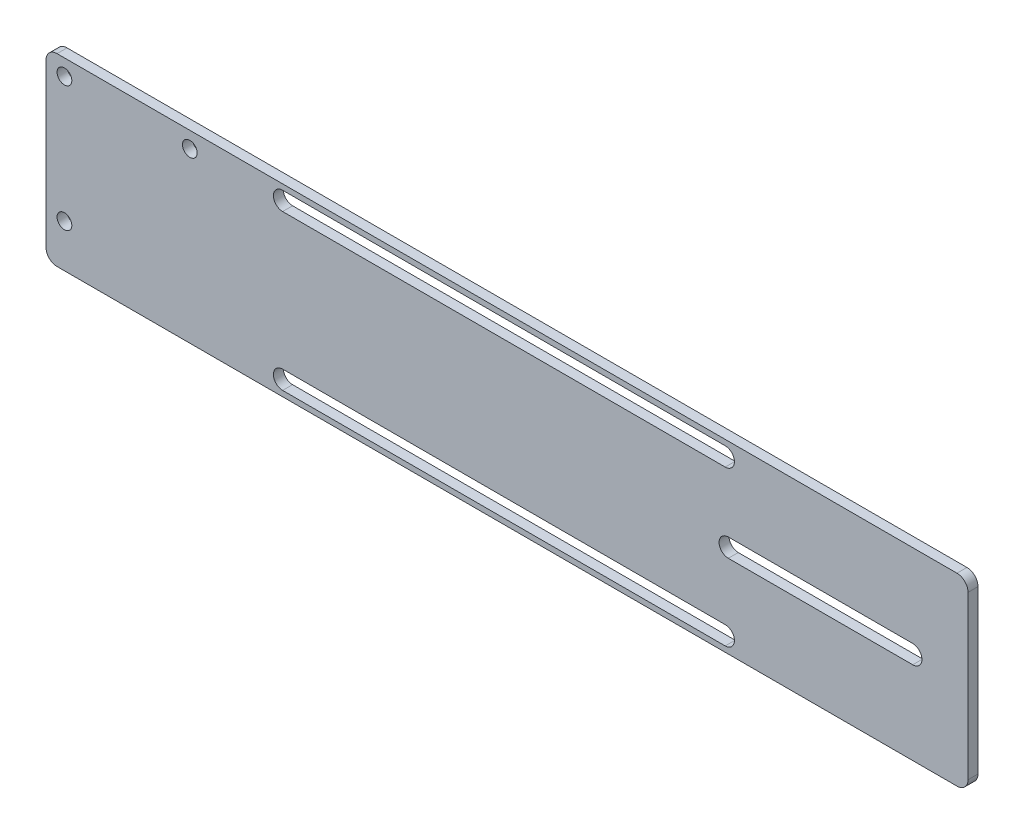
ISO-10303-21;
HEADER;
FILE_DESCRIPTION(('STEP AP214'),'2;1');
FILE_NAME('part.step','',(''),(''),'','','');
FILE_SCHEMA(('AUTOMOTIVE_DESIGN { 1 0 10303 214 1 1 1 1 }'));
ENDSEC;
DATA;
#1=APPLICATION_CONTEXT('core data for automotive mechanical design processes');
#2=APPLICATION_PROTOCOL_DEFINITION('international standard','automotive_design',2000,#1);
#3=PRODUCT_CONTEXT('',#1,'mechanical');
#4=PRODUCT('Part','Part','',(#3));
#5=PRODUCT_RELATED_PRODUCT_CATEGORY('part','',(#4));
#6=PRODUCT_DEFINITION_FORMATION('','',#4);
#7=PRODUCT_DEFINITION_CONTEXT('part definition',#1,'design');
#8=PRODUCT_DEFINITION('design','',#6,#7);
#9=PRODUCT_DEFINITION_SHAPE('','',#8);
#10=(LENGTH_UNIT() NAMED_UNIT(*) SI_UNIT(.MILLI.,.METRE.));
#11=(NAMED_UNIT(*) PLANE_ANGLE_UNIT() SI_UNIT($,.RADIAN.));
#12=(NAMED_UNIT(*) SI_UNIT($,.STERADIAN.) SOLID_ANGLE_UNIT());
#13=UNCERTAINTY_MEASURE_WITH_UNIT(LENGTH_MEASURE(1.E-05),#10,'distance_accuracy_value','');
#14=(GEOMETRIC_REPRESENTATION_CONTEXT(3) GLOBAL_UNCERTAINTY_ASSIGNED_CONTEXT((#13)) GLOBAL_UNIT_ASSIGNED_CONTEXT((#10,
#11,#12)) REPRESENTATION_CONTEXT('',''));
#15=CARTESIAN_POINT('',(0.,0.,0.));
#16=DIRECTION('',(0.,0.,1.));
#17=DIRECTION('',(1.,0.,0.));
#18=AXIS2_PLACEMENT_3D('',#15,#16,#17);
#19=CARTESIAN_POINT('',(0.,-23.5,2.7));
#20=DIRECTION('',(0.,1.,0.));
#21=DIRECTION('',(-1.,0.,0.));
#22=AXIS2_PLACEMENT_3D('',#19,#20,#21);
#23=PLANE('',#22);
#24=DIRECTION('',(1.,0.,0.));
#25=VECTOR('',#24,1.);
#26=CARTESIAN_POINT('',(0.,-23.5,0.));
#27=LINE('',#26,#25);
#28=CARTESIAN_POINT('',(64.1586357395223,-23.5,0.));
#29=VERTEX_POINT('',#28);
#30=CARTESIAN_POINT('',(184.158635739522,-23.5,0.));
#31=VERTEX_POINT('',#30);
#32=EDGE_CURVE('E311',#29,#31,#27,.T.);
#33=ORIENTED_EDGE('',*,*,#32,.F.);
#34=DIRECTION('',(0.,0.,-1.));
#35=VECTOR('',#34,1.);
#36=CARTESIAN_POINT('',(64.1586357395223,-23.5,2.7));
#37=LINE('',#36,#35);
#38=CARTESIAN_POINT('',(64.1586357395223,-23.5,2.7));
#39=VERTEX_POINT('',#38);
#40=EDGE_CURVE('E11',#39,#29,#37,.T.);
#41=ORIENTED_EDGE('',*,*,#40,.F.);
#42=DIRECTION('',(1.,0.,0.));
#43=VECTOR('',#42,1.);
#44=CARTESIAN_POINT('',(0.,-23.5,2.7));
#45=LINE('',#44,#43);
#46=CARTESIAN_POINT('',(184.158635739522,-23.5,2.7));
#47=VERTEX_POINT('',#46);
#48=EDGE_CURVE('E198',#39,#47,#45,.T.);
#49=ORIENTED_EDGE('',*,*,#48,.T.);
#50=DIRECTION('',(0.,0.,-1.));
#51=VECTOR('',#50,1.);
#52=CARTESIAN_POINT('',(184.158635739522,-23.5,2.7));
#53=LINE('',#52,#51);
#54=EDGE_CURVE('E126',#47,#31,#53,.T.);
#55=ORIENTED_EDGE('',*,*,#54,.T.);
#56=EDGE_LOOP('',(#33,#41,#49,#55));
#57=FACE_BOUND('',#56,.T.);
#58=ADVANCED_FACE('F37',(#57),#23,.T.);
#59=CARTESIAN_POINT('',(64.1586357395223,-21.,2.7));
#60=DIRECTION('',(0.,0.,-1.));
#61=DIRECTION('',(-1.,0.,0.));
#62=AXIS2_PLACEMENT_3D('',#59,#60,#61);
#63=CYLINDRICAL_SURFACE('',#62,2.50000000000001);
#64=CARTESIAN_POINT('',(64.1586357395223,-21.,0.));
#65=DIRECTION('',(0.,0.,1.));
#66=DIRECTION('',(1.,0.,0.));
#67=AXIS2_PLACEMENT_3D('',#64,#65,#66);
#68=CIRCLE('',#67,2.50000000000001);
#69=CARTESIAN_POINT('',(64.1586357395223,-18.5,0.));
#70=VERTEX_POINT('',#69);
#71=EDGE_CURVE('E203',#29,#70,#68,.F.);
#72=ORIENTED_EDGE('',*,*,#71,.T.);
#73=DIRECTION('',(0.,0.,-1.));
#74=VECTOR('',#73,1.);
#75=CARTESIAN_POINT('',(64.1586357395223,-18.5,2.7));
#76=LINE('',#75,#74);
#77=CARTESIAN_POINT('',(64.1586357395223,-18.5,2.7));
#78=VERTEX_POINT('',#77);
#79=EDGE_CURVE('E47',#78,#70,#76,.T.);
#80=ORIENTED_EDGE('',*,*,#79,.F.);
#81=CARTESIAN_POINT('',(64.1586357395223,-21.,2.7));
#82=DIRECTION('',(0.,0.,1.));
#83=DIRECTION('',(1.,0.,0.));
#84=AXIS2_PLACEMENT_3D('',#81,#82,#83);
#85=CIRCLE('',#84,2.50000000000001);
#86=EDGE_CURVE('E194',#39,#78,#85,.F.);
#87=ORIENTED_EDGE('',*,*,#86,.F.);
#88=ORIENTED_EDGE('',*,*,#40,.T.);
#89=EDGE_LOOP('',(#72,#80,#87,#88));
#90=FACE_BOUND('',#89,.T.);
#91=ADVANCED_FACE('F201',(#90),#63,.F.);
#92=CARTESIAN_POINT('',(0.,-18.5,2.7));
#93=DIRECTION('',(0.,1.,0.));
#94=DIRECTION('',(-1.,0.,0.));
#95=AXIS2_PLACEMENT_3D('',#92,#93,#94);
#96=PLANE('',#95);
#97=DIRECTION('',(1.,0.,0.));
#98=VECTOR('',#97,1.);
#99=CARTESIAN_POINT('',(0.,-18.5,0.));
#100=LINE('',#99,#98);
#101=CARTESIAN_POINT('',(184.158635739522,-18.5,0.));
#102=VERTEX_POINT('',#101);
#103=EDGE_CURVE('E314',#70,#102,#100,.T.);
#104=ORIENTED_EDGE('',*,*,#103,.T.);
#105=DIRECTION('',(0.,0.,-1.));
#106=VECTOR('',#105,1.);
#107=CARTESIAN_POINT('',(184.158635739522,-18.5,2.7));
#108=LINE('',#107,#106);
#109=CARTESIAN_POINT('',(184.158635739522,-18.5,2.7));
#110=VERTEX_POINT('',#109);
#111=EDGE_CURVE('E193',#110,#102,#108,.T.);
#112=ORIENTED_EDGE('',*,*,#111,.F.);
#113=DIRECTION('',(1.,0.,0.));
#114=VECTOR('',#113,1.);
#115=CARTESIAN_POINT('',(0.,-18.5,2.7));
#116=LINE('',#115,#114);
#117=EDGE_CURVE('E187',#78,#110,#116,.T.);
#118=ORIENTED_EDGE('',*,*,#117,.F.);
#119=ORIENTED_EDGE('',*,*,#79,.T.);
#120=EDGE_LOOP('',(#104,#112,#118,#119));
#121=FACE_BOUND('',#120,.T.);
#122=ADVANCED_FACE('F190',(#121),#96,.F.);
#123=CARTESIAN_POINT('',(3.,22.,2.7));
#124=DIRECTION('',(0.,0.,-1.));
#125=DIRECTION('',(-1.,0.,0.));
#126=AXIS2_PLACEMENT_3D('',#123,#124,#125);
#127=CYLINDRICAL_SURFACE('',#126,3.);
#128=CARTESIAN_POINT('',(3.,22.,0.));
#129=DIRECTION('',(0.,0.,1.));
#130=DIRECTION('',(1.,0.,0.));
#131=AXIS2_PLACEMENT_3D('',#128,#129,#130);
#132=CIRCLE('',#131,3.);
#133=CARTESIAN_POINT('',(0.,22.,0.));
#134=VERTEX_POINT('',#133);
#135=CARTESIAN_POINT('',(3.00000000000002,25.,0.));
#136=VERTEX_POINT('',#135);
#137=EDGE_CURVE('E287',#134,#136,#132,.F.);
#138=ORIENTED_EDGE('',*,*,#137,.F.);
#139=DIRECTION('',(0.,0.,-1.));
#140=VECTOR('',#139,1.);
#141=CARTESIAN_POINT('',(0.,22.,2.7));
#142=LINE('',#141,#140);
#143=CARTESIAN_POINT('',(0.,22.,2.7));
#144=VERTEX_POINT('',#143);
#145=EDGE_CURVE('E225',#144,#134,#142,.T.);
#146=ORIENTED_EDGE('',*,*,#145,.F.);
#147=CARTESIAN_POINT('',(3.,22.,2.7));
#148=DIRECTION('',(0.,0.,1.));
#149=DIRECTION('',(1.,0.,0.));
#150=AXIS2_PLACEMENT_3D('',#147,#148,#149);
#151=CIRCLE('',#150,3.);
#152=CARTESIAN_POINT('',(3.00000000000002,25.,2.7));
#153=VERTEX_POINT('',#152);
#154=EDGE_CURVE('E345',#144,#153,#151,.F.);
#155=ORIENTED_EDGE('',*,*,#154,.T.);
#156=DIRECTION('',(0.,0.,-1.));
#157=VECTOR('',#156,1.);
#158=CARTESIAN_POINT('',(3.00000000000002,25.,2.7));
#159=LINE('',#158,#157);
#160=EDGE_CURVE('E208',#153,#136,#159,.T.);
#161=ORIENTED_EDGE('',*,*,#160,.T.);
#162=EDGE_LOOP('',(#138,#146,#155,#161));
#163=FACE_BOUND('',#162,.T.);
#164=ADVANCED_FACE('F413',(#163),#127,.T.);
#165=CARTESIAN_POINT('',(0.,0.,2.7));
#166=DIRECTION('',(1.,0.,0.));
#167=DIRECTION('',(0.,1.,0.));
#168=AXIS2_PLACEMENT_3D('',#165,#166,#167);
#169=PLANE('',#168);
#170=DIRECTION('',(0.,-1.,0.));
#171=VECTOR('',#170,1.);
#172=CARTESIAN_POINT('',(0.,0.,0.));
#173=LINE('',#172,#171);
#174=CARTESIAN_POINT('',(0.,-22.,0.));
#175=VERTEX_POINT('',#174);
#176=EDGE_CURVE('E290',#134,#175,#173,.T.);
#177=ORIENTED_EDGE('',*,*,#176,.T.);
#178=DIRECTION('',(0.,0.,-1.));
#179=VECTOR('',#178,1.);
#180=CARTESIAN_POINT('',(0.,-22.,2.7));
#181=LINE('',#180,#179);
#182=CARTESIAN_POINT('',(0.,-22.,2.7));
#183=VERTEX_POINT('',#182);
#184=EDGE_CURVE('E222',#183,#175,#181,.T.);
#185=ORIENTED_EDGE('',*,*,#184,.F.);
#186=DIRECTION('',(0.,-1.,0.));
#187=VECTOR('',#186,1.);
#188=CARTESIAN_POINT('',(0.,0.,2.7));
#189=LINE('',#188,#187);
#190=EDGE_CURVE('E348',#144,#183,#189,.T.);
#191=ORIENTED_EDGE('',*,*,#190,.F.);
#192=ORIENTED_EDGE('',*,*,#145,.T.);
#193=EDGE_LOOP('',(#177,#185,#191,#192));
#194=FACE_BOUND('',#193,.T.);
#195=ADVANCED_FACE('F409',(#194),#169,.F.);
#196=CARTESIAN_POINT('',(3.00000000000001,-22.,2.7));
#197=DIRECTION('',(0.,0.,-1.));
#198=DIRECTION('',(-1.,0.,0.));
#199=AXIS2_PLACEMENT_3D('',#196,#197,#198);
#200=CYLINDRICAL_SURFACE('',#199,3.);
#201=CARTESIAN_POINT('',(3.00000000000001,-22.,0.));
#202=DIRECTION('',(0.,0.,1.));
#203=DIRECTION('',(1.,0.,0.));
#204=AXIS2_PLACEMENT_3D('',#201,#202,#203);
#205=CIRCLE('',#204,3.);
#206=CARTESIAN_POINT('',(3.00000000000003,-25.,0.));
#207=VERTEX_POINT('',#206);
#208=EDGE_CURVE('E293',#175,#207,#205,.T.);
#209=ORIENTED_EDGE('',*,*,#208,.T.);
#210=DIRECTION('',(0.,0.,-1.));
#211=VECTOR('',#210,1.);
#212=CARTESIAN_POINT('',(3.00000000000003,-25.,2.7));
#213=LINE('',#212,#211);
#214=CARTESIAN_POINT('',(3.00000000000003,-25.,2.7));
#215=VERTEX_POINT('',#214);
#216=EDGE_CURVE('E219',#215,#207,#213,.T.);
#217=ORIENTED_EDGE('',*,*,#216,.F.);
#218=CARTESIAN_POINT('',(3.00000000000001,-22.,2.7));
#219=DIRECTION('',(0.,0.,1.));
#220=DIRECTION('',(1.,0.,0.));
#221=AXIS2_PLACEMENT_3D('',#218,#219,#220);
#222=CIRCLE('',#221,3.);
#223=EDGE_CURVE('E351',#183,#215,#222,.T.);
#224=ORIENTED_EDGE('',*,*,#223,.F.);
#225=ORIENTED_EDGE('',*,*,#184,.T.);
#226=EDGE_LOOP('',(#209,#217,#224,#225));
#227=FACE_BOUND('',#226,.T.);
#228=ADVANCED_FACE('F405',(#227),#200,.T.);
#229=CARTESIAN_POINT('',(0.,-25.,2.7));
#230=DIRECTION('',(0.,1.,0.));
#231=DIRECTION('',(0.,0.,1.));
#232=AXIS2_PLACEMENT_3D('',#229,#230,#231);
#233=PLANE('',#232);
#234=DIRECTION('',(1.,0.,0.));
#235=VECTOR('',#234,1.);
#236=CARTESIAN_POINT('',(0.,-25.,0.));
#237=LINE('',#236,#235);
#238=CARTESIAN_POINT('',(247.,-25.,0.));
#239=VERTEX_POINT('',#238);
#240=EDGE_CURVE('E296',#207,#239,#237,.T.);
#241=ORIENTED_EDGE('',*,*,#240,.T.);
#242=DIRECTION('',(0.,0.,-1.));
#243=VECTOR('',#242,1.);
#244=CARTESIAN_POINT('',(247.,-25.,2.7));
#245=LINE('',#244,#243);
#246=CARTESIAN_POINT('',(247.,-25.,2.7));
#247=VERTEX_POINT('',#246);
#248=EDGE_CURVE('E217',#247,#239,#245,.T.);
#249=ORIENTED_EDGE('',*,*,#248,.F.);
#250=DIRECTION('',(1.,0.,0.));
#251=VECTOR('',#250,1.);
#252=CARTESIAN_POINT('',(0.,-25.,2.7));
#253=LINE('',#252,#251);
#254=EDGE_CURVE('E354',#215,#247,#253,.T.);
#255=ORIENTED_EDGE('',*,*,#254,.F.);
#256=ORIENTED_EDGE('',*,*,#216,.T.);
#257=EDGE_LOOP('',(#241,#249,#255,#256));
#258=FACE_BOUND('',#257,.T.);
#259=ADVANCED_FACE('F401',(#258),#233,.F.);
#260=CARTESIAN_POINT('',(247.,-22.,2.7));
#261=DIRECTION('',(0.,0.,-1.));
#262=DIRECTION('',(-1.,0.,0.));
#263=AXIS2_PLACEMENT_3D('',#260,#261,#262);
#264=CYLINDRICAL_SURFACE('',#263,3.);
#265=CARTESIAN_POINT('',(247.,-22.,0.));
#266=DIRECTION('',(0.,0.,1.));
#267=DIRECTION('',(1.,0.,0.));
#268=AXIS2_PLACEMENT_3D('',#265,#266,#267);
#269=CIRCLE('',#268,3.);
#270=CARTESIAN_POINT('',(250.,-22.,0.));
#271=VERTEX_POINT('',#270);
#272=EDGE_CURVE('E299',#271,#239,#269,.F.);
#273=ORIENTED_EDGE('',*,*,#272,.F.);
#274=DIRECTION('',(0.,0.,-1.));
#275=VECTOR('',#274,1.);
#276=CARTESIAN_POINT('',(250.,-22.,2.7));
#277=LINE('',#276,#275);
#278=CARTESIAN_POINT('',(250.,-22.,2.7));
#279=VERTEX_POINT('',#278);
#280=EDGE_CURVE('E215',#279,#271,#277,.T.);
#281=ORIENTED_EDGE('',*,*,#280,.F.);
#282=CARTESIAN_POINT('',(247.,-22.,2.7));
#283=DIRECTION('',(0.,0.,1.));
#284=DIRECTION('',(1.,0.,0.));
#285=AXIS2_PLACEMENT_3D('',#282,#283,#284);
#286=CIRCLE('',#285,3.);
#287=EDGE_CURVE('E356',#279,#247,#286,.F.);
#288=ORIENTED_EDGE('',*,*,#287,.T.);
#289=ORIENTED_EDGE('',*,*,#248,.T.);
#290=EDGE_LOOP('',(#273,#281,#288,#289));
#291=FACE_BOUND('',#290,.T.);
#292=ADVANCED_FACE('F397',(#291),#264,.T.);
#293=CARTESIAN_POINT('',(250.,0.,2.7));
#294=DIRECTION('',(1.,0.,0.));
#295=DIRECTION('',(0.,0.,-1.));
#296=AXIS2_PLACEMENT_3D('',#293,#294,#295);
#297=PLANE('',#296);
#298=DIRECTION('',(0.,-1.,0.));
#299=VECTOR('',#298,1.);
#300=CARTESIAN_POINT('',(250.,0.,0.));
#301=LINE('',#300,#299);
#302=CARTESIAN_POINT('',(250.,22.,0.));
#303=VERTEX_POINT('',#302);
#304=EDGE_CURVE('E302',#303,#271,#301,.T.);
#305=ORIENTED_EDGE('',*,*,#304,.F.);
#306=DIRECTION('',(0.,0.,-1.));
#307=VECTOR('',#306,1.);
#308=CARTESIAN_POINT('',(250.,22.,2.7));
#309=LINE('',#308,#307);
#310=CARTESIAN_POINT('',(250.,22.,2.7));
#311=VERTEX_POINT('',#310);
#312=EDGE_CURVE('E213',#311,#303,#309,.T.);
#313=ORIENTED_EDGE('',*,*,#312,.F.);
#314=DIRECTION('',(0.,-1.,0.));
#315=VECTOR('',#314,1.);
#316=CARTESIAN_POINT('',(250.,0.,2.7));
#317=LINE('',#316,#315);
#318=EDGE_CURVE('E359',#311,#279,#317,.T.);
#319=ORIENTED_EDGE('',*,*,#318,.T.);
#320=ORIENTED_EDGE('',*,*,#280,.T.);
#321=EDGE_LOOP('',(#305,#313,#319,#320));
#322=FACE_BOUND('',#321,.T.);
#323=ADVANCED_FACE('F393',(#322),#297,.T.);
#324=CARTESIAN_POINT('',(247.,22.,2.7));
#325=DIRECTION('',(0.,0.,-1.));
#326=DIRECTION('',(-1.,0.,0.));
#327=AXIS2_PLACEMENT_3D('',#324,#325,#326);
#328=CYLINDRICAL_SURFACE('',#327,3.);
#329=CARTESIAN_POINT('',(247.,22.,0.));
#330=DIRECTION('',(0.,0.,1.));
#331=DIRECTION('',(1.,0.,0.));
#332=AXIS2_PLACEMENT_3D('',#329,#330,#331);
#333=CIRCLE('',#332,3.);
#334=CARTESIAN_POINT('',(247.,25.,0.));
#335=VERTEX_POINT('',#334);
#336=EDGE_CURVE('E305',#303,#335,#333,.T.);
#337=ORIENTED_EDGE('',*,*,#336,.T.);
#338=DIRECTION('',(0.,0.,-1.));
#339=VECTOR('',#338,1.);
#340=CARTESIAN_POINT('',(247.,25.,2.7));
#341=LINE('',#340,#339);
#342=CARTESIAN_POINT('',(247.,25.,2.7));
#343=VERTEX_POINT('',#342);
#344=EDGE_CURVE('E210',#343,#335,#341,.T.);
#345=ORIENTED_EDGE('',*,*,#344,.F.);
#346=CARTESIAN_POINT('',(247.,22.,2.7));
#347=DIRECTION('',(0.,0.,1.));
#348=DIRECTION('',(1.,0.,0.));
#349=AXIS2_PLACEMENT_3D('',#346,#347,#348);
#350=CIRCLE('',#349,3.);
#351=EDGE_CURVE('E362',#311,#343,#350,.T.);
#352=ORIENTED_EDGE('',*,*,#351,.F.);
#353=ORIENTED_EDGE('',*,*,#312,.T.);
#354=EDGE_LOOP('',(#337,#345,#352,#353));
#355=FACE_BOUND('',#354,.T.);
#356=ADVANCED_FACE('F389',(#355),#328,.T.);
#357=CARTESIAN_POINT('',(184.158635739522,21.,2.7));
#358=DIRECTION('',(0.,0.,-1.));
#359=DIRECTION('',(-1.,0.,0.));
#360=AXIS2_PLACEMENT_3D('',#357,#358,#359);
#361=CYLINDRICAL_SURFACE('',#360,2.5);
#362=CARTESIAN_POINT('',(184.158635739522,21.,0.));
#363=DIRECTION('',(0.,0.,1.));
#364=DIRECTION('',(1.,0.,0.));
#365=AXIS2_PLACEMENT_3D('',#362,#363,#364);
#366=CIRCLE('',#365,2.5);
#367=CARTESIAN_POINT('',(184.158635739522,18.5,0.));
#368=VERTEX_POINT('',#367);
#369=CARTESIAN_POINT('',(184.158635739522,23.5,0.));
#370=VERTEX_POINT('',#369);
#371=EDGE_CURVE('E266',#368,#370,#366,.T.);
#372=ORIENTED_EDGE('',*,*,#371,.F.);
#373=DIRECTION('',(0.,0.,-1.));
#374=VECTOR('',#373,1.);
#375=CARTESIAN_POINT('',(184.158635739522,18.5,2.7));
#376=LINE('',#375,#374);
#377=CARTESIAN_POINT('',(184.158635739522,18.5,2.7));
#378=VERTEX_POINT('',#377);
#379=EDGE_CURVE('E211',#378,#368,#376,.T.);
#380=ORIENTED_EDGE('',*,*,#379,.F.);
#381=CARTESIAN_POINT('',(184.158635739522,21.,2.7));
#382=DIRECTION('',(0.,0.,1.));
#383=DIRECTION('',(1.,0.,0.));
#384=AXIS2_PLACEMENT_3D('',#381,#382,#383);
#385=CIRCLE('',#384,2.5);
#386=CARTESIAN_POINT('',(184.158635739522,23.5,2.7));
#387=VERTEX_POINT('',#386);
#388=EDGE_CURVE('E325',#378,#387,#385,.T.);
#389=ORIENTED_EDGE('',*,*,#388,.T.);
#390=DIRECTION('',(0.,0.,-1.));
#391=VECTOR('',#390,1.);
#392=CARTESIAN_POINT('',(184.158635739522,23.5,2.7));
#393=LINE('',#392,#391);
#394=EDGE_CURVE('E227',#387,#370,#393,.T.);
#395=ORIENTED_EDGE('',*,*,#394,.T.);
#396=EDGE_LOOP('',(#372,#380,#389,#395));
#397=FACE_BOUND('',#396,.T.);
#398=ADVANCED_FACE('F392',(#397),#361,.F.);
#399=CARTESIAN_POINT('',(0.,18.5,2.7));
#400=DIRECTION('',(0.,1.,0.));
#401=DIRECTION('',(-1.,0.,0.));
#402=AXIS2_PLACEMENT_3D('',#399,#400,#401);
#403=PLANE('',#402);
#404=DIRECTION('',(1.,0.,0.));
#405=VECTOR('',#404,1.);
#406=CARTESIAN_POINT('',(0.,18.5,0.));
#407=LINE('',#406,#405);
#408=CARTESIAN_POINT('',(64.1586357395223,18.5,0.));
#409=VERTEX_POINT('',#408);
#410=EDGE_CURVE('E269',#409,#368,#407,.T.);
#411=ORIENTED_EDGE('',*,*,#410,.F.);
#412=DIRECTION('',(0.,0.,-1.));
#413=VECTOR('',#412,1.);
#414=CARTESIAN_POINT('',(64.1586357395223,18.5,2.7));
#415=LINE('',#414,#413);
#416=CARTESIAN_POINT('',(64.1586357395223,18.5,2.7));
#417=VERTEX_POINT('',#416);
#418=EDGE_CURVE('E231',#417,#409,#415,.T.);
#419=ORIENTED_EDGE('',*,*,#418,.F.);
#420=DIRECTION('',(1.,0.,0.));
#421=VECTOR('',#420,1.);
#422=CARTESIAN_POINT('',(0.,18.5,2.7));
#423=LINE('',#422,#421);
#424=EDGE_CURVE('E328',#417,#378,#423,.T.);
#425=ORIENTED_EDGE('',*,*,#424,.T.);
#426=ORIENTED_EDGE('',*,*,#379,.T.);
#427=EDGE_LOOP('',(#411,#419,#425,#426));
#428=FACE_BOUND('',#427,.T.);
#429=ADVANCED_FACE('F437',(#428),#403,.T.);
#430=CARTESIAN_POINT('',(64.1586357395223,21.,2.7));
#431=DIRECTION('',(0.,0.,-1.));
#432=DIRECTION('',(-1.,0.,0.));
#433=AXIS2_PLACEMENT_3D('',#430,#431,#432);
#434=CYLINDRICAL_SURFACE('',#433,2.50000000000001);
#435=CARTESIAN_POINT('',(64.1586357395223,21.,0.));
#436=DIRECTION('',(0.,0.,1.));
#437=DIRECTION('',(1.,0.,0.));
#438=AXIS2_PLACEMENT_3D('',#435,#436,#437);
#439=CIRCLE('',#438,2.50000000000001);
#440=CARTESIAN_POINT('',(64.1586357395223,23.5,0.));
#441=VERTEX_POINT('',#440);
#442=EDGE_CURVE('E272',#441,#409,#439,.T.);
#443=ORIENTED_EDGE('',*,*,#442,.F.);
#444=DIRECTION('',(0.,0.,-1.));
#445=VECTOR('',#444,1.);
#446=CARTESIAN_POINT('',(64.1586357395223,23.5,2.7));
#447=LINE('',#446,#445);
#448=CARTESIAN_POINT('',(64.1586357395223,23.5,2.7));
#449=VERTEX_POINT('',#448);
#450=EDGE_CURVE('E229',#449,#441,#447,.T.);
#451=ORIENTED_EDGE('',*,*,#450,.F.);
#452=CARTESIAN_POINT('',(64.1586357395223,21.,2.7));
#453=DIRECTION('',(0.,0.,1.));
#454=DIRECTION('',(1.,0.,0.));
#455=AXIS2_PLACEMENT_3D('',#452,#453,#454);
#456=CIRCLE('',#455,2.50000000000001);
#457=EDGE_CURVE('E331',#449,#417,#456,.T.);
#458=ORIENTED_EDGE('',*,*,#457,.T.);
#459=ORIENTED_EDGE('',*,*,#418,.T.);
#460=EDGE_LOOP('',(#443,#451,#458,#459));
#461=FACE_BOUND('',#460,.T.);
#462=ADVANCED_FACE('F434',(#461),#434,.F.);
#463=CARTESIAN_POINT('',(0.,-2.50000000000001,2.7));
#464=DIRECTION('',(0.,-1.,0.));
#465=DIRECTION('',(0.,0.,-1.));
#466=AXIS2_PLACEMENT_3D('',#463,#464,#465);
#467=PLANE('',#466);
#468=DIRECTION('',(-1.,0.,0.));
#469=VECTOR('',#468,1.);
#470=CARTESIAN_POINT('',(0.,-2.50000000000001,0.));
#471=LINE('',#470,#469);
#472=CARTESIAN_POINT('',(235.,-2.50000000000001,0.));
#473=VERTEX_POINT('',#472);
#474=CARTESIAN_POINT('',(185.,-2.50000000000001,0.));
#475=VERTEX_POINT('',#474);
#476=EDGE_CURVE('E252',#473,#475,#471,.T.);
#477=ORIENTED_EDGE('',*,*,#476,.T.);
#478=DIRECTION('',(0.,0.,-1.));
#479=VECTOR('',#478,1.);
#480=CARTESIAN_POINT('',(185.,-2.50000000000001,2.7));
#481=LINE('',#480,#479);
#482=CARTESIAN_POINT('',(185.,-2.50000000000001,2.7));
#483=VERTEX_POINT('',#482);
#484=EDGE_CURVE('E41',#483,#475,#481,.T.);
#485=ORIENTED_EDGE('',*,*,#484,.F.);
#486=DIRECTION('',(-1.,0.,0.));
#487=VECTOR('',#486,1.);
#488=CARTESIAN_POINT('',(0.,-2.50000000000001,2.7));
#489=LINE('',#488,#487);
#490=CARTESIAN_POINT('',(235.,-2.50000000000001,2.7));
#491=VERTEX_POINT('',#490);
#492=EDGE_CURVE('E134',#491,#483,#489,.T.);
#493=ORIENTED_EDGE('',*,*,#492,.F.);
#494=DIRECTION('',(0.,0.,-1.));
#495=VECTOR('',#494,1.);
#496=CARTESIAN_POINT('',(235.,-2.50000000000001,2.7));
#497=LINE('',#496,#495);
#498=EDGE_CURVE('E234',#491,#473,#497,.T.);
#499=ORIENTED_EDGE('',*,*,#498,.T.);
#500=EDGE_LOOP('',(#477,#485,#493,#499));
#501=FACE_BOUND('',#500,.T.);
#502=ADVANCED_FACE('F39',(#501),#467,.F.);
#503=CARTESIAN_POINT('',(185.,0.,2.7));
#504=DIRECTION('',(0.,0.,-1.));
#505=DIRECTION('',(-1.,0.,0.));
#506=AXIS2_PLACEMENT_3D('',#503,#504,#505);
#507=CYLINDRICAL_SURFACE('',#506,2.50000000000002);
#508=CARTESIAN_POINT('',(185.,0.,0.));
#509=DIRECTION('',(0.,0.,1.));
#510=DIRECTION('',(1.,0.,0.));
#511=AXIS2_PLACEMENT_3D('',#508,#509,#510);
#512=CIRCLE('',#511,2.50000000000002);
#513=CARTESIAN_POINT('',(185.,2.49999999999999,0.));
#514=VERTEX_POINT('',#513);
#515=EDGE_CURVE('E248',#514,#475,#512,.T.);
#516=ORIENTED_EDGE('',*,*,#515,.F.);
#517=DIRECTION('',(0.,0.,-1.));
#518=VECTOR('',#517,1.);
#519=CARTESIAN_POINT('',(185.,2.49999999999999,2.7));
#520=LINE('',#519,#518);
#521=CARTESIAN_POINT('',(185.,2.49999999999999,2.7));
#522=VERTEX_POINT('',#521);
#523=EDGE_CURVE('E237',#522,#514,#520,.T.);
#524=ORIENTED_EDGE('',*,*,#523,.F.);
#525=CARTESIAN_POINT('',(185.,0.,2.7));
#526=DIRECTION('',(0.,0.,1.));
#527=DIRECTION('',(1.,0.,0.));
#528=AXIS2_PLACEMENT_3D('',#525,#526,#527);
#529=CIRCLE('',#528,2.50000000000002);
#530=EDGE_CURVE('E249',#522,#483,#529,.T.);
#531=ORIENTED_EDGE('',*,*,#530,.T.);
#532=ORIENTED_EDGE('',*,*,#484,.T.);
#533=EDGE_LOOP('',(#516,#524,#531,#532));
#534=FACE_BOUND('',#533,.T.);
#535=ADVANCED_FACE('F246',(#534),#507,.F.);
#536=CARTESIAN_POINT('',(0.,2.49999999999999,2.7));
#537=DIRECTION('',(0.,1.,0.));
#538=DIRECTION('',(-1.,0.,0.));
#539=AXIS2_PLACEMENT_3D('',#536,#537,#538);
#540=PLANE('',#539);
#541=DIRECTION('',(1.,0.,0.));
#542=VECTOR('',#541,1.);
#543=CARTESIAN_POINT('',(0.,2.49999999999999,0.));
#544=LINE('',#543,#542);
#545=CARTESIAN_POINT('',(235.,2.49999999999999,0.));
#546=VERTEX_POINT('',#545);
#547=EDGE_CURVE('E259',#514,#546,#544,.T.);
#548=ORIENTED_EDGE('',*,*,#547,.T.);
#549=DIRECTION('',(0.,0.,-1.));
#550=VECTOR('',#549,1.);
#551=CARTESIAN_POINT('',(235.,2.49999999999999,2.7));
#552=LINE('',#551,#550);
#553=CARTESIAN_POINT('',(235.,2.49999999999999,2.7));
#554=VERTEX_POINT('',#553);
#555=EDGE_CURVE('E236',#554,#546,#552,.T.);
#556=ORIENTED_EDGE('',*,*,#555,.F.);
#557=DIRECTION('',(1.,0.,0.));
#558=VECTOR('',#557,1.);
#559=CARTESIAN_POINT('',(0.,2.49999999999999,2.7));
#560=LINE('',#559,#558);
#561=EDGE_CURVE('E318',#522,#554,#560,.T.);
#562=ORIENTED_EDGE('',*,*,#561,.F.);
#563=ORIENTED_EDGE('',*,*,#523,.T.);
#564=EDGE_LOOP('',(#548,#556,#562,#563));
#565=FACE_BOUND('',#564,.T.);
#566=ADVANCED_FACE('F387',(#565),#540,.F.);
#567=CARTESIAN_POINT('',(0.,25.,2.7));
#568=DIRECTION('',(0.,1.,0.));
#569=DIRECTION('',(0.,0.,1.));
#570=AXIS2_PLACEMENT_3D('',#567,#568,#569);
#571=PLANE('',#570);
#572=DIRECTION('',(1.,0.,0.));
#573=VECTOR('',#572,1.);
#574=CARTESIAN_POINT('',(0.,25.,0.));
#575=LINE('',#574,#573);
#576=EDGE_CURVE('E308',#136,#335,#575,.T.);
#577=ORIENTED_EDGE('',*,*,#576,.F.);
#578=ORIENTED_EDGE('',*,*,#160,.F.);
#579=DIRECTION('',(1.,0.,0.));
#580=VECTOR('',#579,1.);
#581=CARTESIAN_POINT('',(0.,25.,2.7));
#582=LINE('',#581,#580);
#583=EDGE_CURVE('E364',#153,#343,#582,.T.);
#584=ORIENTED_EDGE('',*,*,#583,.T.);
#585=ORIENTED_EDGE('',*,*,#344,.T.);
#586=EDGE_LOOP('',(#577,#578,#584,#585));
#587=FACE_BOUND('',#586,.T.);
#588=ADVANCED_FACE('F383',(#587),#571,.T.);
#589=CARTESIAN_POINT('',(5.,20.65,2.7));
#590=DIRECTION('',(0.,0.,-1.));
#591=DIRECTION('',(-1.,0.,0.));
#592=AXIS2_PLACEMENT_3D('',#589,#590,#591);
#593=CYLINDRICAL_SURFACE('',#592,2.);
#594=CARTESIAN_POINT('',(5.,20.65,2.7));
#595=DIRECTION('',(0.,0.,1.));
#596=DIRECTION('',(1.,0.,0.));
#597=AXIS2_PLACEMENT_3D('',#594,#595,#596);
#598=CIRCLE('',#597,2.);
#599=CARTESIAN_POINT('',(3.,20.65,2.7));
#600=VERTEX_POINT('',#599);
#601=EDGE_CURVE('E342',#600,#600,#598,.T.);
#602=CARTESIAN_POINT('',(5.,20.65,0.));
#603=DIRECTION('',(0.,0.,1.));
#604=DIRECTION('',(1.,0.,0.));
#605=AXIS2_PLACEMENT_3D('',#602,#603,#604);
#606=CIRCLE('',#605,2.);
#607=CARTESIAN_POINT('',(3.,20.65,0.));
#608=VERTEX_POINT('',#607);
#609=EDGE_CURVE('E284',#608,#608,#606,.T.);
#610=CARTESIAN_POINT('',(3.,20.65,2.7));
#611=CARTESIAN_POINT('',(3.,20.65,2.671875));
#612=CARTESIAN_POINT('',(3.,20.65,2.64375));
#613=CARTESIAN_POINT('',(3.,20.65,2.5875));
#614=CARTESIAN_POINT('',(3.,20.65,2.559375));
#615=CARTESIAN_POINT('',(3.,20.65,2.503125));
#616=CARTESIAN_POINT('',(3.,20.65,2.475));
#617=CARTESIAN_POINT('',(3.,20.65,2.41875));
#618=CARTESIAN_POINT('',(3.,20.65,2.390625));
#619=CARTESIAN_POINT('',(3.,20.65,2.334375));
#620=CARTESIAN_POINT('',(3.,20.65,2.30625));
#621=CARTESIAN_POINT('',(3.,20.65,2.25));
#622=CARTESIAN_POINT('',(3.,20.65,2.221875));
#623=CARTESIAN_POINT('',(3.,20.65,2.165625));
#624=CARTESIAN_POINT('',(3.,20.65,2.1375));
#625=CARTESIAN_POINT('',(3.,20.65,2.08125));
#626=CARTESIAN_POINT('',(3.,20.65,2.053125));
#627=CARTESIAN_POINT('',(3.,20.65,1.996875));
#628=CARTESIAN_POINT('',(3.,20.65,1.96875));
#629=CARTESIAN_POINT('',(3.,20.65,1.9125));
#630=CARTESIAN_POINT('',(3.,20.65,1.884375));
#631=CARTESIAN_POINT('',(3.,20.65,1.828125));
#632=CARTESIAN_POINT('',(3.,20.65,1.8));
#633=CARTESIAN_POINT('',(3.,20.65,1.74375));
#634=CARTESIAN_POINT('',(3.,20.65,1.715625));
#635=CARTESIAN_POINT('',(3.,20.65,1.659375));
#636=CARTESIAN_POINT('',(3.,20.65,1.63125));
#637=CARTESIAN_POINT('',(3.,20.65,1.575));
#638=CARTESIAN_POINT('',(3.,20.65,1.546875));
#639=CARTESIAN_POINT('',(3.,20.65,1.490625));
#640=CARTESIAN_POINT('',(3.,20.65,1.4625));
#641=CARTESIAN_POINT('',(3.,20.65,1.40625));
#642=CARTESIAN_POINT('',(3.,20.65,1.378125));
#643=CARTESIAN_POINT('',(3.,20.65,1.321875));
#644=CARTESIAN_POINT('',(3.,20.65,1.29375));
#645=CARTESIAN_POINT('',(3.,20.65,1.2375));
#646=CARTESIAN_POINT('',(3.,20.65,1.209375));
#647=CARTESIAN_POINT('',(3.,20.65,1.153125));
#648=CARTESIAN_POINT('',(3.,20.65,1.125));
#649=CARTESIAN_POINT('',(3.,20.65,1.06875));
#650=CARTESIAN_POINT('',(3.,20.65,1.040625));
#651=CARTESIAN_POINT('',(3.,20.65,0.984375));
#652=CARTESIAN_POINT('',(3.,20.65,0.956249999999999));
#653=CARTESIAN_POINT('',(3.,20.65,0.899999999999999));
#654=CARTESIAN_POINT('',(3.,20.65,0.871875));
#655=CARTESIAN_POINT('',(3.,20.65,0.815624999999999));
#656=CARTESIAN_POINT('',(3.,20.65,0.787499999999999));
#657=CARTESIAN_POINT('',(3.,20.65,0.73125));
#658=CARTESIAN_POINT('',(3.,20.65,0.703125));
#659=CARTESIAN_POINT('',(3.,20.65,0.646875));
#660=CARTESIAN_POINT('',(3.,20.65,0.61875));
#661=CARTESIAN_POINT('',(3.,20.65,0.5625));
#662=CARTESIAN_POINT('',(3.,20.65,0.534375));
#663=CARTESIAN_POINT('',(3.,20.65,0.478125));
#664=CARTESIAN_POINT('',(3.,20.65,0.45));
#665=CARTESIAN_POINT('',(3.,20.65,0.39375));
#666=CARTESIAN_POINT('',(3.,20.65,0.365625));
#667=CARTESIAN_POINT('',(3.,20.65,0.309375));
#668=CARTESIAN_POINT('',(3.,20.65,0.28125));
#669=CARTESIAN_POINT('',(3.,20.65,0.225));
#670=CARTESIAN_POINT('',(3.,20.65,0.196875));
#671=CARTESIAN_POINT('',(3.,20.65,0.140625));
#672=CARTESIAN_POINT('',(3.,20.65,0.1125));
#673=CARTESIAN_POINT('',(3.,20.65,0.0562499999999997));
#674=CARTESIAN_POINT('',(3.,20.65,0.0281249999999996));
#675=CARTESIAN_POINT('',(3.,20.65,0.));
#676=B_SPLINE_CURVE_WITH_KNOTS('',3,(#610,#611,#612,#613,#614,#615,#616,#617,#618,#619,#620,
#621,#622,#623,#624,#625,#626,#627,#628,#629,#630,#631,#632,#633,#634,#635,#636,#637,#638,#639,
#640,#641,#642,#643,#644,#645,#646,#647,#648,#649,#650,#651,#652,#653,#654,#655,#656,#657,#658,
#659,#660,#661,#662,#663,#664,#665,#666,#667,#668,#669,#670,#671,#672,#673,#674,#675),
.UNSPECIFIED.,.F.,.F.,(4,2,2,2,2,2,2,2,2,2,2,2,2,2,2,2,2,2,2,2,2,2,2,2,2,2,2,2,2,2,2,2,4),(0.,
0.0843750000000003,0.16875,0.253125,0.3375,0.421875,0.50625,0.590625,0.675,0.759375,0.84375,
0.928125000000001,1.0125,1.096875,1.18125,1.265625,1.35,1.434375,1.51875,1.603125,1.6875,
1.771875,1.85625,1.940625,2.025,2.109375,2.19375,2.278125,2.3625,2.446875,2.53125,2.615625,2.7),.UNSPECIFIED.);
#677=EDGE_CURVE('BSEAM386',#600,#608,#676,.T.);
#678=ORIENTED_EDGE('',*,*,#601,.T.);
#679=ORIENTED_EDGE('',*,*,#609,.F.);
#680=ORIENTED_EDGE('',*,*,#677,.T.);
#681=ORIENTED_EDGE('',*,*,#677,.F.);
#682=EDGE_LOOP('',(#678,#680,#679,#681));
#683=FACE_BOUND('',#682,.T.);
#684=ADVANCED_FACE('F386',(#683),#593,.F.);
#685=CARTESIAN_POINT('',(39.,20.65,2.7));
#686=DIRECTION('',(0.,0.,-1.));
#687=DIRECTION('',(-1.,0.,0.));
#688=AXIS2_PLACEMENT_3D('',#685,#686,#687);
#689=CYLINDRICAL_SURFACE('',#688,2.);
#690=CARTESIAN_POINT('',(39.,20.65,2.7));
#691=DIRECTION('',(0.,0.,1.));
#692=DIRECTION('',(1.,0.,0.));
#693=AXIS2_PLACEMENT_3D('',#690,#691,#692);
#694=CIRCLE('',#693,2.);
#695=CARTESIAN_POINT('',(37.,20.65,2.7));
#696=VERTEX_POINT('',#695);
#697=EDGE_CURVE('E339',#696,#696,#694,.T.);
#698=CARTESIAN_POINT('',(39.,20.65,0.));
#699=DIRECTION('',(0.,0.,1.));
#700=DIRECTION('',(1.,0.,0.));
#701=AXIS2_PLACEMENT_3D('',#698,#699,#700);
#702=CIRCLE('',#701,2.);
#703=CARTESIAN_POINT('',(37.,20.65,0.));
#704=VERTEX_POINT('',#703);
#705=EDGE_CURVE('E281',#704,#704,#702,.T.);
#706=CARTESIAN_POINT('',(37.,20.65,2.7));
#707=CARTESIAN_POINT('',(37.,20.65,2.671875));
#708=CARTESIAN_POINT('',(37.,20.65,2.64375));
#709=CARTESIAN_POINT('',(37.,20.65,2.5875));
#710=CARTESIAN_POINT('',(37.,20.65,2.559375));
#711=CARTESIAN_POINT('',(37.,20.65,2.503125));
#712=CARTESIAN_POINT('',(37.,20.65,2.475));
#713=CARTESIAN_POINT('',(37.,20.65,2.41875));
#714=CARTESIAN_POINT('',(37.,20.65,2.390625));
#715=CARTESIAN_POINT('',(37.,20.65,2.334375));
#716=CARTESIAN_POINT('',(37.,20.65,2.30625));
#717=CARTESIAN_POINT('',(37.,20.65,2.25));
#718=CARTESIAN_POINT('',(37.,20.65,2.221875));
#719=CARTESIAN_POINT('',(37.,20.65,2.165625));
#720=CARTESIAN_POINT('',(37.,20.65,2.1375));
#721=CARTESIAN_POINT('',(37.,20.65,2.08125));
#722=CARTESIAN_POINT('',(37.,20.65,2.053125));
#723=CARTESIAN_POINT('',(37.,20.65,1.996875));
#724=CARTESIAN_POINT('',(37.,20.65,1.96875));
#725=CARTESIAN_POINT('',(37.,20.65,1.9125));
#726=CARTESIAN_POINT('',(37.,20.65,1.884375));
#727=CARTESIAN_POINT('',(37.,20.65,1.828125));
#728=CARTESIAN_POINT('',(37.,20.65,1.8));
#729=CARTESIAN_POINT('',(37.,20.65,1.74375));
#730=CARTESIAN_POINT('',(37.,20.65,1.715625));
#731=CARTESIAN_POINT('',(37.,20.65,1.659375));
#732=CARTESIAN_POINT('',(37.,20.65,1.63125));
#733=CARTESIAN_POINT('',(37.,20.65,1.575));
#734=CARTESIAN_POINT('',(37.,20.65,1.546875));
#735=CARTESIAN_POINT('',(37.,20.65,1.490625));
#736=CARTESIAN_POINT('',(37.,20.65,1.4625));
#737=CARTESIAN_POINT('',(37.,20.65,1.40625));
#738=CARTESIAN_POINT('',(37.,20.65,1.378125));
#739=CARTESIAN_POINT('',(37.,20.65,1.321875));
#740=CARTESIAN_POINT('',(37.,20.65,1.29375));
#741=CARTESIAN_POINT('',(37.,20.65,1.2375));
#742=CARTESIAN_POINT('',(37.,20.65,1.209375));
#743=CARTESIAN_POINT('',(37.,20.65,1.153125));
#744=CARTESIAN_POINT('',(37.,20.65,1.125));
#745=CARTESIAN_POINT('',(37.,20.65,1.06875));
#746=CARTESIAN_POINT('',(37.,20.65,1.040625));
#747=CARTESIAN_POINT('',(37.,20.65,0.984375));
#748=CARTESIAN_POINT('',(37.,20.65,0.956249999999999));
#749=CARTESIAN_POINT('',(37.,20.65,0.899999999999999));
#750=CARTESIAN_POINT('',(37.,20.65,0.871875));
#751=CARTESIAN_POINT('',(37.,20.65,0.815624999999999));
#752=CARTESIAN_POINT('',(37.,20.65,0.787499999999999));
#753=CARTESIAN_POINT('',(37.,20.65,0.73125));
#754=CARTESIAN_POINT('',(37.,20.65,0.703125));
#755=CARTESIAN_POINT('',(37.,20.65,0.646875));
#756=CARTESIAN_POINT('',(37.,20.65,0.61875));
#757=CARTESIAN_POINT('',(37.,20.65,0.5625));
#758=CARTESIAN_POINT('',(37.,20.65,0.534375));
#759=CARTESIAN_POINT('',(37.,20.65,0.478125));
#760=CARTESIAN_POINT('',(37.,20.65,0.45));
#761=CARTESIAN_POINT('',(37.,20.65,0.39375));
#762=CARTESIAN_POINT('',(37.,20.65,0.365625));
#763=CARTESIAN_POINT('',(37.,20.65,0.309375));
#764=CARTESIAN_POINT('',(37.,20.65,0.28125));
#765=CARTESIAN_POINT('',(37.,20.65,0.225));
#766=CARTESIAN_POINT('',(37.,20.65,0.196875));
#767=CARTESIAN_POINT('',(37.,20.65,0.140625));
#768=CARTESIAN_POINT('',(37.,20.65,0.1125));
#769=CARTESIAN_POINT('',(37.,20.65,0.0562499999999997));
#770=CARTESIAN_POINT('',(37.,20.65,0.0281249999999996));
#771=CARTESIAN_POINT('',(37.,20.65,0.));
#772=B_SPLINE_CURVE_WITH_KNOTS('',3,(#706,#707,#708,#709,#710,#711,#712,#713,#714,#715,#716,
#717,#718,#719,#720,#721,#722,#723,#724,#725,#726,#727,#728,#729,#730,#731,#732,#733,#734,#735,
#736,#737,#738,#739,#740,#741,#742,#743,#744,#745,#746,#747,#748,#749,#750,#751,#752,#753,#754,
#755,#756,#757,#758,#759,#760,#761,#762,#763,#764,#765,#766,#767,#768,#769,#770,#771),
.UNSPECIFIED.,.F.,.F.,(4,2,2,2,2,2,2,2,2,2,2,2,2,2,2,2,2,2,2,2,2,2,2,2,2,2,2,2,2,2,2,2,4),(0.,
0.0843750000000003,0.16875,0.253125,0.3375,0.421875,0.50625,0.590625,0.675,0.759375,0.84375,
0.928125000000001,1.0125,1.096875,1.18125,1.265625,1.35,1.434375,1.51875,1.603125,1.6875,
1.771875,1.85625,1.940625,2.025,2.109375,2.19375,2.278125,2.3625,2.446875,2.53125,2.615625,2.7),.UNSPECIFIED.);
#773=EDGE_CURVE('BSEAM420',#696,#704,#772,.T.);
#774=ORIENTED_EDGE('',*,*,#697,.T.);
#775=ORIENTED_EDGE('',*,*,#705,.F.);
#776=ORIENTED_EDGE('',*,*,#773,.T.);
#777=ORIENTED_EDGE('',*,*,#773,.F.);
#778=EDGE_LOOP('',(#774,#776,#775,#777));
#779=FACE_BOUND('',#778,.T.);
#780=ADVANCED_FACE('F420',(#779),#689,.F.);
#781=CARTESIAN_POINT('',(5.00000000000001,-13.35,2.7));
#782=DIRECTION('',(0.,0.,-1.));
#783=DIRECTION('',(-1.,0.,0.));
#784=AXIS2_PLACEMENT_3D('',#781,#782,#783);
#785=CYLINDRICAL_SURFACE('',#784,2.);
#786=CARTESIAN_POINT('',(5.00000000000001,-13.35,2.7));
#787=DIRECTION('',(0.,0.,1.));
#788=DIRECTION('',(1.,0.,0.));
#789=AXIS2_PLACEMENT_3D('',#786,#787,#788);
#790=CIRCLE('',#789,2.);
#791=CARTESIAN_POINT('',(3.00000000000001,-13.35,2.7));
#792=VERTEX_POINT('',#791);
#793=EDGE_CURVE('E336',#792,#792,#790,.T.);
#794=CARTESIAN_POINT('',(5.00000000000001,-13.35,0.));
#795=DIRECTION('',(0.,0.,1.));
#796=DIRECTION('',(1.,0.,0.));
#797=AXIS2_PLACEMENT_3D('',#794,#795,#796);
#798=CIRCLE('',#797,2.);
#799=CARTESIAN_POINT('',(3.00000000000001,-13.35,0.));
#800=VERTEX_POINT('',#799);
#801=EDGE_CURVE('E278',#800,#800,#798,.T.);
#802=CARTESIAN_POINT('',(3.00000000000001,-13.35,2.7));
#803=CARTESIAN_POINT('',(3.00000000000001,-13.35,2.671875));
#804=CARTESIAN_POINT('',(3.00000000000001,-13.35,2.64375));
#805=CARTESIAN_POINT('',(3.00000000000001,-13.35,2.5875));
#806=CARTESIAN_POINT('',(3.00000000000001,-13.35,2.559375));
#807=CARTESIAN_POINT('',(3.00000000000001,-13.35,2.503125));
#808=CARTESIAN_POINT('',(3.00000000000001,-13.35,2.475));
#809=CARTESIAN_POINT('',(3.00000000000001,-13.35,2.41875));
#810=CARTESIAN_POINT('',(3.00000000000001,-13.35,2.390625));
#811=CARTESIAN_POINT('',(3.00000000000001,-13.35,2.334375));
#812=CARTESIAN_POINT('',(3.00000000000001,-13.35,2.30625));
#813=CARTESIAN_POINT('',(3.00000000000001,-13.35,2.25));
#814=CARTESIAN_POINT('',(3.00000000000001,-13.35,2.221875));
#815=CARTESIAN_POINT('',(3.00000000000001,-13.35,2.165625));
#816=CARTESIAN_POINT('',(3.00000000000001,-13.35,2.1375));
#817=CARTESIAN_POINT('',(3.00000000000001,-13.35,2.08125));
#818=CARTESIAN_POINT('',(3.00000000000001,-13.35,2.053125));
#819=CARTESIAN_POINT('',(3.00000000000001,-13.35,1.996875));
#820=CARTESIAN_POINT('',(3.00000000000001,-13.35,1.96875));
#821=CARTESIAN_POINT('',(3.00000000000001,-13.35,1.9125));
#822=CARTESIAN_POINT('',(3.00000000000001,-13.35,1.884375));
#823=CARTESIAN_POINT('',(3.00000000000001,-13.35,1.828125));
#824=CARTESIAN_POINT('',(3.00000000000001,-13.35,1.8));
#825=CARTESIAN_POINT('',(3.00000000000001,-13.35,1.74375));
#826=CARTESIAN_POINT('',(3.00000000000001,-13.35,1.715625));
#827=CARTESIAN_POINT('',(3.00000000000001,-13.35,1.659375));
#828=CARTESIAN_POINT('',(3.00000000000001,-13.35,1.63125));
#829=CARTESIAN_POINT('',(3.00000000000001,-13.35,1.575));
#830=CARTESIAN_POINT('',(3.00000000000001,-13.35,1.546875));
#831=CARTESIAN_POINT('',(3.00000000000001,-13.35,1.490625));
#832=CARTESIAN_POINT('',(3.00000000000001,-13.35,1.4625));
#833=CARTESIAN_POINT('',(3.00000000000001,-13.35,1.40625));
#834=CARTESIAN_POINT('',(3.00000000000001,-13.35,1.378125));
#835=CARTESIAN_POINT('',(3.00000000000001,-13.35,1.321875));
#836=CARTESIAN_POINT('',(3.00000000000001,-13.35,1.29375));
#837=CARTESIAN_POINT('',(3.00000000000001,-13.35,1.2375));
#838=CARTESIAN_POINT('',(3.00000000000001,-13.35,1.209375));
#839=CARTESIAN_POINT('',(3.00000000000001,-13.35,1.153125));
#840=CARTESIAN_POINT('',(3.00000000000001,-13.35,1.125));
#841=CARTESIAN_POINT('',(3.00000000000001,-13.35,1.06875));
#842=CARTESIAN_POINT('',(3.00000000000001,-13.35,1.040625));
#843=CARTESIAN_POINT('',(3.00000000000001,-13.35,0.984375));
#844=CARTESIAN_POINT('',(3.00000000000001,-13.35,0.956249999999999));
#845=CARTESIAN_POINT('',(3.00000000000001,-13.35,0.899999999999999));
#846=CARTESIAN_POINT('',(3.00000000000001,-13.35,0.871875));
#847=CARTESIAN_POINT('',(3.00000000000001,-13.35,0.815624999999999));
#848=CARTESIAN_POINT('',(3.00000000000001,-13.35,0.787499999999999));
#849=CARTESIAN_POINT('',(3.00000000000001,-13.35,0.73125));
#850=CARTESIAN_POINT('',(3.00000000000001,-13.35,0.703125));
#851=CARTESIAN_POINT('',(3.00000000000001,-13.35,0.646875));
#852=CARTESIAN_POINT('',(3.00000000000001,-13.35,0.61875));
#853=CARTESIAN_POINT('',(3.00000000000001,-13.35,0.5625));
#854=CARTESIAN_POINT('',(3.00000000000001,-13.35,0.534375));
#855=CARTESIAN_POINT('',(3.00000000000001,-13.35,0.478125));
#856=CARTESIAN_POINT('',(3.00000000000001,-13.35,0.45));
#857=CARTESIAN_POINT('',(3.00000000000001,-13.35,0.39375));
#858=CARTESIAN_POINT('',(3.00000000000001,-13.35,0.365625));
#859=CARTESIAN_POINT('',(3.00000000000001,-13.35,0.309375));
#860=CARTESIAN_POINT('',(3.00000000000001,-13.35,0.28125));
#861=CARTESIAN_POINT('',(3.00000000000001,-13.35,0.225));
#862=CARTESIAN_POINT('',(3.00000000000001,-13.35,0.196875));
#863=CARTESIAN_POINT('',(3.00000000000001,-13.35,0.140625));
#864=CARTESIAN_POINT('',(3.00000000000001,-13.35,0.1125));
#865=CARTESIAN_POINT('',(3.00000000000001,-13.35,0.0562499999999997));
#866=CARTESIAN_POINT('',(3.00000000000001,-13.35,0.0281249999999996));
#867=CARTESIAN_POINT('',(3.00000000000001,-13.35,0.));
#868=B_SPLINE_CURVE_WITH_KNOTS('',3,(#802,#803,#804,#805,#806,#807,#808,#809,#810,#811,#812,
#813,#814,#815,#816,#817,#818,#819,#820,#821,#822,#823,#824,#825,#826,#827,#828,#829,#830,#831,
#832,#833,#834,#835,#836,#837,#838,#839,#840,#841,#842,#843,#844,#845,#846,#847,#848,#849,#850,
#851,#852,#853,#854,#855,#856,#857,#858,#859,#860,#861,#862,#863,#864,#865,#866,#867),
.UNSPECIFIED.,.F.,.F.,(4,2,2,2,2,2,2,2,2,2,2,2,2,2,2,2,2,2,2,2,2,2,2,2,2,2,2,2,2,2,2,2,4),(0.,
0.0843750000000003,0.16875,0.253125,0.3375,0.421875,0.50625,0.590625,0.675,0.759375,0.84375,
0.928125000000001,1.0125,1.096875,1.18125,1.265625,1.35,1.434375,1.51875,1.603125,1.6875,
1.771875,1.85625,1.940625,2.025,2.109375,2.19375,2.278125,2.3625,2.446875,2.53125,2.615625,2.7),.UNSPECIFIED.);
#869=EDGE_CURVE('BSEAM424',#792,#800,#868,.T.);
#870=ORIENTED_EDGE('',*,*,#793,.T.);
#871=ORIENTED_EDGE('',*,*,#801,.F.);
#872=ORIENTED_EDGE('',*,*,#869,.T.);
#873=ORIENTED_EDGE('',*,*,#869,.F.);
#874=EDGE_LOOP('',(#870,#872,#871,#873));
#875=FACE_BOUND('',#874,.T.);
#876=ADVANCED_FACE('F424',(#875),#785,.F.);
#877=CARTESIAN_POINT('',(0.,23.5,2.7));
#878=DIRECTION('',(0.,1.,0.));
#879=DIRECTION('',(0.,0.,1.));
#880=AXIS2_PLACEMENT_3D('',#877,#878,#879);
#881=PLANE('',#880);
#882=DIRECTION('',(1.,0.,0.));
#883=VECTOR('',#882,1.);
#884=CARTESIAN_POINT('',(0.,23.5,0.));
#885=LINE('',#884,#883);
#886=EDGE_CURVE('E275',#441,#370,#885,.T.);
#887=ORIENTED_EDGE('',*,*,#886,.T.);
#888=ORIENTED_EDGE('',*,*,#394,.F.);
#889=DIRECTION('',(1.,0.,0.));
#890=VECTOR('',#889,1.);
#891=CARTESIAN_POINT('',(0.,23.5,2.7));
#892=LINE('',#891,#890);
#893=EDGE_CURVE('E334',#449,#387,#892,.T.);
#894=ORIENTED_EDGE('',*,*,#893,.F.);
#895=ORIENTED_EDGE('',*,*,#450,.T.);
#896=EDGE_LOOP('',(#887,#888,#894,#895));
#897=FACE_BOUND('',#896,.T.);
#898=ADVANCED_FACE('F428',(#897),#881,.F.);
#899=CARTESIAN_POINT('',(235.,0.,2.7));
#900=DIRECTION('',(0.,0.,-1.));
#901=DIRECTION('',(-1.,0.,0.));
#902=AXIS2_PLACEMENT_3D('',#899,#900,#901);
#903=CYLINDRICAL_SURFACE('',#902,2.50000000000001);
#904=CARTESIAN_POINT('',(235.,0.,0.));
#905=DIRECTION('',(0.,0.,1.));
#906=DIRECTION('',(1.,0.,0.));
#907=AXIS2_PLACEMENT_3D('',#904,#905,#906);
#908=CIRCLE('',#907,2.50000000000001);
#909=EDGE_CURVE('E261',#473,#546,#908,.T.);
#910=ORIENTED_EDGE('',*,*,#909,.F.);
#911=ORIENTED_EDGE('',*,*,#498,.F.);
#912=CARTESIAN_POINT('',(235.,0.,2.7));
#913=DIRECTION('',(0.,0.,1.));
#914=DIRECTION('',(1.,0.,0.));
#915=AXIS2_PLACEMENT_3D('',#912,#913,#914);
#916=CIRCLE('',#915,2.50000000000001);
#917=EDGE_CURVE('E322',#491,#554,#916,.T.);
#918=ORIENTED_EDGE('',*,*,#917,.T.);
#919=ORIENTED_EDGE('',*,*,#555,.T.);
#920=EDGE_LOOP('',(#910,#911,#918,#919));
#921=FACE_BOUND('',#920,.T.);
#922=ADVANCED_FACE('F432',(#921),#903,.F.);
#923=CARTESIAN_POINT('',(184.158635739522,-21.,2.7));
#924=DIRECTION('',(0.,0.,-1.));
#925=DIRECTION('',(-1.,0.,0.));
#926=AXIS2_PLACEMENT_3D('',#923,#924,#925);
#927=CYLINDRICAL_SURFACE('',#926,2.5);
#928=CARTESIAN_POINT('',(184.158635739522,-21.,0.));
#929=DIRECTION('',(0.,0.,1.));
#930=DIRECTION('',(1.,0.,0.));
#931=AXIS2_PLACEMENT_3D('',#928,#929,#930);
#932=CIRCLE('',#931,2.5);
#933=EDGE_CURVE('E119',#102,#31,#932,.F.);
#934=ORIENTED_EDGE('',*,*,#933,.T.);
#935=ORIENTED_EDGE('',*,*,#54,.F.);
#936=CARTESIAN_POINT('',(184.158635739522,-21.,2.7));
#937=DIRECTION('',(0.,0.,1.));
#938=DIRECTION('',(1.,0.,0.));
#939=AXIS2_PLACEMENT_3D('',#936,#937,#938);
#940=CIRCLE('',#939,2.5);
#941=EDGE_CURVE('E56',#110,#47,#940,.F.);
#942=ORIENTED_EDGE('',*,*,#941,.F.);
#943=ORIENTED_EDGE('',*,*,#111,.T.);
#944=EDGE_LOOP('',(#934,#935,#942,#943));
#945=FACE_BOUND('',#944,.T.);
#946=ADVANCED_FACE('F372',(#945),#927,.F.);
#947=CARTESIAN_POINT('',(0.,0.,2.7));
#948=DIRECTION('',(0.,0.,1.));
#949=DIRECTION('',(1.,0.,0.));
#950=AXIS2_PLACEMENT_3D('',#947,#948,#949);
#951=PLANE('',#950);
#952=ORIENTED_EDGE('',*,*,#492,.T.);
#953=ORIENTED_EDGE('',*,*,#530,.F.);
#954=ORIENTED_EDGE('',*,*,#561,.T.);
#955=ORIENTED_EDGE('',*,*,#917,.F.);
#956=EDGE_LOOP('',(#952,#953,#954,#955));
#957=FACE_BOUND('',#956,.T.);
#958=ORIENTED_EDGE('',*,*,#388,.F.);
#959=ORIENTED_EDGE('',*,*,#424,.F.);
#960=ORIENTED_EDGE('',*,*,#457,.F.);
#961=ORIENTED_EDGE('',*,*,#893,.T.);
#962=EDGE_LOOP('',(#958,#959,#960,#961));
#963=FACE_BOUND('',#962,.T.);
#964=ORIENTED_EDGE('',*,*,#793,.F.);
#965=EDGE_LOOP('',(#964));
#966=FACE_BOUND('',#965,.T.);
#967=ORIENTED_EDGE('',*,*,#697,.F.);
#968=EDGE_LOOP('',(#967));
#969=FACE_BOUND('',#968,.T.);
#970=ORIENTED_EDGE('',*,*,#601,.F.);
#971=EDGE_LOOP('',(#970));
#972=FACE_BOUND('',#971,.T.);
#973=ORIENTED_EDGE('',*,*,#154,.F.);
#974=ORIENTED_EDGE('',*,*,#190,.T.);
#975=ORIENTED_EDGE('',*,*,#223,.T.);
#976=ORIENTED_EDGE('',*,*,#254,.T.);
#977=ORIENTED_EDGE('',*,*,#287,.F.);
#978=ORIENTED_EDGE('',*,*,#318,.F.);
#979=ORIENTED_EDGE('',*,*,#351,.T.);
#980=ORIENTED_EDGE('',*,*,#583,.F.);
#981=EDGE_LOOP('',(#973,#974,#975,#976,#977,#978,#979,#980));
#982=FACE_BOUND('',#981,.T.);
#983=ORIENTED_EDGE('',*,*,#48,.F.);
#984=ORIENTED_EDGE('',*,*,#86,.T.);
#985=ORIENTED_EDGE('',*,*,#117,.T.);
#986=ORIENTED_EDGE('',*,*,#941,.T.);
#987=EDGE_LOOP('',(#983,#984,#985,#986));
#988=FACE_BOUND('',#987,.T.);
#989=ADVANCED_FACE('F197',(#957,#963,#966,#969,#972,#982,#988),#951,.T.);
#990=CARTESIAN_POINT('',(0.,0.,0.));
#991=DIRECTION('',(0.,0.,1.));
#992=DIRECTION('',(1.,0.,0.));
#993=AXIS2_PLACEMENT_3D('',#990,#991,#992);
#994=PLANE('',#993);
#995=ORIENTED_EDGE('',*,*,#476,.F.);
#996=ORIENTED_EDGE('',*,*,#909,.T.);
#997=ORIENTED_EDGE('',*,*,#547,.F.);
#998=ORIENTED_EDGE('',*,*,#515,.T.);
#999=EDGE_LOOP('',(#995,#996,#997,#998));
#1000=FACE_BOUND('',#999,.T.);
#1001=ORIENTED_EDGE('',*,*,#371,.T.);
#1002=ORIENTED_EDGE('',*,*,#886,.F.);
#1003=ORIENTED_EDGE('',*,*,#442,.T.);
#1004=ORIENTED_EDGE('',*,*,#410,.T.);
#1005=EDGE_LOOP('',(#1001,#1002,#1003,#1004));
#1006=FACE_BOUND('',#1005,.T.);
#1007=ORIENTED_EDGE('',*,*,#801,.T.);
#1008=EDGE_LOOP('',(#1007));
#1009=FACE_BOUND('',#1008,.T.);
#1010=ORIENTED_EDGE('',*,*,#705,.T.);
#1011=EDGE_LOOP('',(#1010));
#1012=FACE_BOUND('',#1011,.T.);
#1013=ORIENTED_EDGE('',*,*,#609,.T.);
#1014=EDGE_LOOP('',(#1013));
#1015=FACE_BOUND('',#1014,.T.);
#1016=ORIENTED_EDGE('',*,*,#137,.T.);
#1017=ORIENTED_EDGE('',*,*,#576,.T.);
#1018=ORIENTED_EDGE('',*,*,#336,.F.);
#1019=ORIENTED_EDGE('',*,*,#304,.T.);
#1020=ORIENTED_EDGE('',*,*,#272,.T.);
#1021=ORIENTED_EDGE('',*,*,#240,.F.);
#1022=ORIENTED_EDGE('',*,*,#208,.F.);
#1023=ORIENTED_EDGE('',*,*,#176,.F.);
#1024=EDGE_LOOP('',(#1016,#1017,#1018,#1019,#1020,#1021,#1022,#1023));
#1025=FACE_BOUND('',#1024,.T.);
#1026=ORIENTED_EDGE('',*,*,#32,.T.);
#1027=ORIENTED_EDGE('',*,*,#933,.F.);
#1028=ORIENTED_EDGE('',*,*,#103,.F.);
#1029=ORIENTED_EDGE('',*,*,#71,.F.);
#1030=EDGE_LOOP('',(#1026,#1027,#1028,#1029));
#1031=FACE_BOUND('',#1030,.T.);
#1032=ADVANCED_FACE('F257',(#1000,#1006,#1009,#1012,#1015,#1025,#1031),#994,.F.);
#1033=CLOSED_SHELL('',(#58,#91,#122,#164,#195,#228,#259,#292,#323,#356,#398,#429,#462,#502,#535,
#566,#588,#684,#780,#876,#898,#922,#946,#989,#1032));
#1034=MANIFOLD_SOLID_BREP('B2',#1033);
#1035=ADVANCED_BREP_SHAPE_REPRESENTATION('',(#18,#1034),#14);
#1036=SHAPE_DEFINITION_REPRESENTATION(#9,#1035);
ENDSEC;
END-ISO-10303-21;
